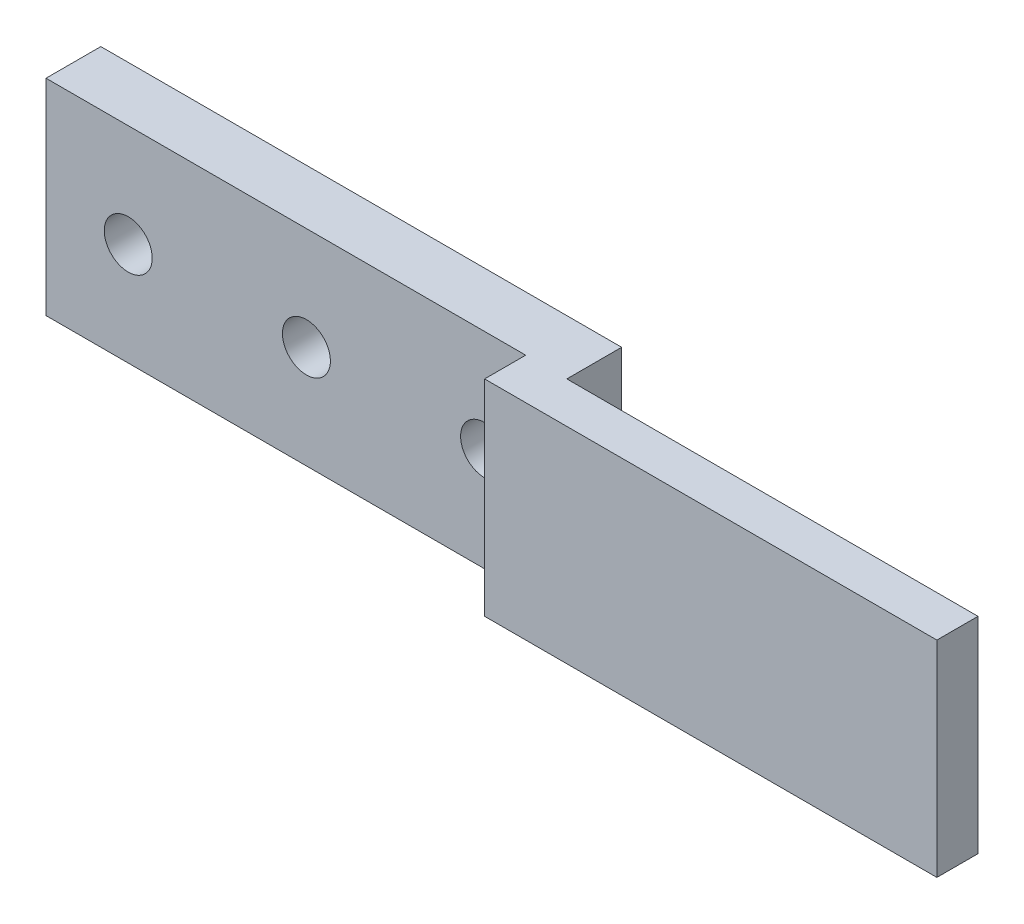
ISO-10303-21;
HEADER;
FILE_DESCRIPTION(('STEP AP214'),'2;1');
FILE_NAME('part.step','',(''),(''),'','','');
FILE_SCHEMA(('AUTOMOTIVE_DESIGN { 1 0 10303 214 1 1 1 1 }'));
ENDSEC;
DATA;
#1=APPLICATION_CONTEXT('core data for automotive mechanical design processes');
#2=APPLICATION_PROTOCOL_DEFINITION('international standard','automotive_design',2000,#1);
#3=PRODUCT_CONTEXT('',#1,'mechanical');
#4=PRODUCT('Part','Part','',(#3));
#5=PRODUCT_RELATED_PRODUCT_CATEGORY('part','',(#4));
#6=PRODUCT_DEFINITION_FORMATION('','',#4);
#7=PRODUCT_DEFINITION_CONTEXT('part definition',#1,'design');
#8=PRODUCT_DEFINITION('design','',#6,#7);
#9=PRODUCT_DEFINITION_SHAPE('','',#8);
#10=(LENGTH_UNIT() NAMED_UNIT(*) SI_UNIT(.MILLI.,.METRE.));
#11=(NAMED_UNIT(*) PLANE_ANGLE_UNIT() SI_UNIT($,.RADIAN.));
#12=(NAMED_UNIT(*) SI_UNIT($,.STERADIAN.) SOLID_ANGLE_UNIT());
#13=UNCERTAINTY_MEASURE_WITH_UNIT(LENGTH_MEASURE(1.E-05),#10,'distance_accuracy_value','');
#14=(GEOMETRIC_REPRESENTATION_CONTEXT(3) GLOBAL_UNCERTAINTY_ASSIGNED_CONTEXT((#13)) GLOBAL_UNIT_ASSIGNED_CONTEXT((#10,
#11,#12)) REPRESENTATION_CONTEXT('',''));
#15=CARTESIAN_POINT('',(0.,0.,0.));
#16=DIRECTION('',(0.,0.,1.));
#17=DIRECTION('',(1.,0.,0.));
#18=AXIS2_PLACEMENT_3D('',#15,#16,#17);
#19=CARTESIAN_POINT('',(12.5,-7.5,3.));
#20=DIRECTION('',(-1.,0.,0.));
#21=DIRECTION('',(0.,0.,1.));
#22=AXIS2_PLACEMENT_3D('',#19,#20,#21);
#23=PLANE('',#22);
#24=DIRECTION('',(0.,1.,0.));
#25=VECTOR('',#24,1.);
#26=CARTESIAN_POINT('',(12.5,-7.50000000000001,3.));
#27=LINE('',#26,#25);
#28=CARTESIAN_POINT('',(12.5,-7.5,3.));
#29=VERTEX_POINT('',#28);
#30=CARTESIAN_POINT('',(12.5,7.5,3.));
#31=VERTEX_POINT('',#30);
#32=EDGE_CURVE('E58',#29,#31,#27,.T.);
#33=ORIENTED_EDGE('',*,*,#32,.F.);
#34=DIRECTION('',(0.,0.,-1.));
#35=VECTOR('',#34,1.);
#36=CARTESIAN_POINT('',(12.5,-7.5,3.));
#37=LINE('',#36,#35);
#38=CARTESIAN_POINT('',(12.5,-7.5,-1.));
#39=VERTEX_POINT('',#38);
#40=EDGE_CURVE('E11',#29,#39,#37,.T.);
#41=ORIENTED_EDGE('',*,*,#40,.T.);
#42=DIRECTION('',(0.,-1.,0.));
#43=VECTOR('',#42,1.);
#44=CARTESIAN_POINT('',(12.5,7.5,-1.));
#45=LINE('',#44,#43);
#46=CARTESIAN_POINT('',(12.5,7.5,-1.));
#47=VERTEX_POINT('',#46);
#48=EDGE_CURVE('E116',#47,#39,#45,.T.);
#49=ORIENTED_EDGE('',*,*,#48,.F.);
#50=DIRECTION('',(0.,0.,-1.));
#51=VECTOR('',#50,1.);
#52=CARTESIAN_POINT('',(12.5,7.5,3.));
#53=LINE('',#52,#51);
#54=EDGE_CURVE('E52',#31,#47,#53,.T.);
#55=ORIENTED_EDGE('',*,*,#54,.F.);
#56=EDGE_LOOP('',(#33,#41,#49,#55));
#57=FACE_BOUND('',#56,.T.);
#58=ADVANCED_FACE('F43',(#57),#23,.F.);
#59=CARTESIAN_POINT('',(12.5,-7.5,3.));
#60=DIRECTION('',(0.,1.,0.));
#61=DIRECTION('',(-1.,0.,0.));
#62=AXIS2_PLACEMENT_3D('',#59,#60,#61);
#63=PLANE('',#62);
#64=DIRECTION('',(1.,0.,0.));
#65=VECTOR('',#64,1.);
#66=CARTESIAN_POINT('',(12.5,-7.5,3.));
#67=LINE('',#66,#65);
#68=CARTESIAN_POINT('',(-25.5,-7.5,3.));
#69=VERTEX_POINT('',#68);
#70=CARTESIAN_POINT('',(9.5,-7.5,3.));
#71=VERTEX_POINT('',#70);
#72=EDGE_CURVE('E124',#69,#71,#67,.T.);
#73=ORIENTED_EDGE('',*,*,#72,.F.);
#74=DIRECTION('',(0.,0.,1.));
#75=VECTOR('',#74,1.);
#76=CARTESIAN_POINT('',(-25.5,-7.5,-1.));
#77=LINE('',#76,#75);
#78=CARTESIAN_POINT('',(-25.5,-7.5,-1.));
#79=VERTEX_POINT('',#78);
#80=EDGE_CURVE('E122',#79,#69,#77,.T.);
#81=ORIENTED_EDGE('',*,*,#80,.F.);
#82=DIRECTION('',(-1.,0.,0.));
#83=VECTOR('',#82,1.);
#84=CARTESIAN_POINT('',(12.5,-7.5,-1.));
#85=LINE('',#84,#83);
#86=EDGE_CURVE('E109',#39,#79,#85,.T.);
#87=ORIENTED_EDGE('',*,*,#86,.F.);
#88=ORIENTED_EDGE('',*,*,#40,.F.);
#89=DIRECTION('',(-1.,0.,0.));
#90=VECTOR('',#89,1.);
#91=CARTESIAN_POINT('',(42.5,-7.50000000000001,3.));
#92=LINE('',#91,#90);
#93=CARTESIAN_POINT('',(42.5,-7.50000000000001,3.));
#94=VERTEX_POINT('',#93);
#95=EDGE_CURVE('E188',#94,#29,#92,.T.);
#96=ORIENTED_EDGE('',*,*,#95,.F.);
#97=DIRECTION('',(0.,0.,-1.));
#98=VECTOR('',#97,1.);
#99=CARTESIAN_POINT('',(42.5,-7.50000000000001,6.));
#100=LINE('',#99,#98);
#101=CARTESIAN_POINT('',(42.5,-7.50000000000001,6.));
#102=VERTEX_POINT('',#101);
#103=EDGE_CURVE('E172',#102,#94,#100,.T.);
#104=ORIENTED_EDGE('',*,*,#103,.F.);
#105=DIRECTION('',(1.,0.,0.));
#106=VECTOR('',#105,1.);
#107=CARTESIAN_POINT('',(12.5,-7.50000000000001,6.));
#108=LINE('',#107,#106);
#109=CARTESIAN_POINT('',(9.5,-7.5,6.));
#110=VERTEX_POINT('',#109);
#111=EDGE_CURVE('E198',#110,#102,#108,.T.);
#112=ORIENTED_EDGE('',*,*,#111,.F.);
#113=DIRECTION('',(0.,0.,-1.));
#114=VECTOR('',#113,1.);
#115=CARTESIAN_POINT('',(9.5,-7.5,6.));
#116=LINE('',#115,#114);
#117=EDGE_CURVE('E201',#110,#71,#116,.T.);
#118=ORIENTED_EDGE('',*,*,#117,.T.);
#119=EDGE_LOOP('',(#73,#81,#87,#88,#96,#104,#112,#118));
#120=FACE_BOUND('',#119,.T.);
#121=ADVANCED_FACE('F45',(#120),#63,.F.);
#122=CARTESIAN_POINT('',(12.5,7.5,3.));
#123=DIRECTION('',(0.,-1.,0.));
#124=DIRECTION('',(1.,0.,0.));
#125=AXIS2_PLACEMENT_3D('',#122,#123,#124);
#126=PLANE('',#125);
#127=ORIENTED_EDGE('',*,*,#54,.T.);
#128=DIRECTION('',(1.,0.,0.));
#129=VECTOR('',#128,1.);
#130=CARTESIAN_POINT('',(12.5,7.5,-1.));
#131=LINE('',#130,#129);
#132=CARTESIAN_POINT('',(-25.5,7.5,-1.));
#133=VERTEX_POINT('',#132);
#134=EDGE_CURVE('E119',#133,#47,#131,.T.);
#135=ORIENTED_EDGE('',*,*,#134,.F.);
#136=DIRECTION('',(0.,0.,-1.));
#137=VECTOR('',#136,1.);
#138=CARTESIAN_POINT('',(-25.5,7.5,-1.));
#139=LINE('',#138,#137);
#140=CARTESIAN_POINT('',(-25.5,7.5,3.));
#141=VERTEX_POINT('',#140);
#142=EDGE_CURVE('E134',#141,#133,#139,.T.);
#143=ORIENTED_EDGE('',*,*,#142,.F.);
#144=DIRECTION('',(-1.,0.,0.));
#145=VECTOR('',#144,1.);
#146=CARTESIAN_POINT('',(12.5,7.5,3.));
#147=LINE('',#146,#145);
#148=CARTESIAN_POINT('',(9.5,7.5,3.));
#149=VERTEX_POINT('',#148);
#150=EDGE_CURVE('E212',#149,#141,#147,.T.);
#151=ORIENTED_EDGE('',*,*,#150,.F.);
#152=DIRECTION('',(0.,0.,-1.));
#153=VECTOR('',#152,1.);
#154=CARTESIAN_POINT('',(9.5,7.5,6.));
#155=LINE('',#154,#153);
#156=CARTESIAN_POINT('',(9.5,7.5,6.));
#157=VERTEX_POINT('',#156);
#158=EDGE_CURVE('E206',#157,#149,#155,.T.);
#159=ORIENTED_EDGE('',*,*,#158,.F.);
#160=DIRECTION('',(-1.,0.,0.));
#161=VECTOR('',#160,1.);
#162=CARTESIAN_POINT('',(12.5,7.5,6.));
#163=LINE('',#162,#161);
#164=CARTESIAN_POINT('',(42.5,7.5,6.));
#165=VERTEX_POINT('',#164);
#166=EDGE_CURVE('E192',#165,#157,#163,.T.);
#167=ORIENTED_EDGE('',*,*,#166,.F.);
#168=DIRECTION('',(0.,0.,1.));
#169=VECTOR('',#168,1.);
#170=CARTESIAN_POINT('',(42.5,7.5,6.));
#171=LINE('',#170,#169);
#172=CARTESIAN_POINT('',(42.5,7.5,3.));
#173=VERTEX_POINT('',#172);
#174=EDGE_CURVE('E178',#173,#165,#171,.T.);
#175=ORIENTED_EDGE('',*,*,#174,.F.);
#176=DIRECTION('',(-1.,0.,0.));
#177=VECTOR('',#176,1.);
#178=CARTESIAN_POINT('',(42.5,7.5,3.));
#179=LINE('',#178,#177);
#180=EDGE_CURVE('E182',#173,#31,#179,.T.);
#181=ORIENTED_EDGE('',*,*,#180,.T.);
#182=EDGE_LOOP('',(#127,#135,#143,#151,#159,#167,#175,#181));
#183=FACE_BOUND('',#182,.T.);
#184=ADVANCED_FACE('F216',(#183),#126,.F.);
#185=CARTESIAN_POINT('',(0.,0.,3.));
#186=DIRECTION('',(0.,0.,1.));
#187=DIRECTION('',(1.,0.,0.));
#188=AXIS2_PLACEMENT_3D('',#185,#186,#187);
#189=PLANE('',#188);
#190=CARTESIAN_POINT('',(-19.5,0.,3.));
#191=DIRECTION('',(0.,0.,1.));
#192=DIRECTION('',(1.,0.,0.));
#193=AXIS2_PLACEMENT_3D('',#190,#191,#192);
#194=CIRCLE('',#193,1.75);
#195=CARTESIAN_POINT('',(-17.75,0.,3.));
#196=VERTEX_POINT('',#195);
#197=EDGE_CURVE('E140',#196,#196,#194,.T.);
#198=ORIENTED_EDGE('',*,*,#197,.F.);
#199=EDGE_LOOP('',(#198));
#200=FACE_BOUND('',#199,.T.);
#201=CARTESIAN_POINT('',(6.5,0.,3.));
#202=DIRECTION('',(0.,0.,1.));
#203=DIRECTION('',(1.,0.,0.));
#204=AXIS2_PLACEMENT_3D('',#201,#202,#203);
#205=CIRCLE('',#204,1.75);
#206=CARTESIAN_POINT('',(8.25,0.,3.));
#207=VERTEX_POINT('',#206);
#208=EDGE_CURVE('E160',#207,#207,#205,.T.);
#209=ORIENTED_EDGE('',*,*,#208,.F.);
#210=EDGE_LOOP('',(#209));
#211=FACE_BOUND('',#210,.T.);
#212=CARTESIAN_POINT('',(-6.5,0.,3.));
#213=DIRECTION('',(0.,0.,1.));
#214=DIRECTION('',(1.,0.,0.));
#215=AXIS2_PLACEMENT_3D('',#212,#213,#214);
#216=CIRCLE('',#215,1.75);
#217=CARTESIAN_POINT('',(-4.75,0.,3.));
#218=VERTEX_POINT('',#217);
#219=EDGE_CURVE('E153',#218,#218,#216,.T.);
#220=ORIENTED_EDGE('',*,*,#219,.F.);
#221=EDGE_LOOP('',(#220));
#222=FACE_BOUND('',#221,.T.);
#223=DIRECTION('',(0.,-1.,0.));
#224=VECTOR('',#223,1.);
#225=CARTESIAN_POINT('',(9.5,7.5,3.));
#226=LINE('',#225,#224);
#227=EDGE_CURVE('E66',#149,#71,#226,.T.);
#228=ORIENTED_EDGE('',*,*,#227,.F.);
#229=ORIENTED_EDGE('',*,*,#150,.T.);
#230=DIRECTION('',(0.,1.,0.));
#231=VECTOR('',#230,1.);
#232=CARTESIAN_POINT('',(-25.5,7.5,3.));
#233=LINE('',#232,#231);
#234=EDGE_CURVE('E129',#69,#141,#233,.T.);
#235=ORIENTED_EDGE('',*,*,#234,.F.);
#236=ORIENTED_EDGE('',*,*,#72,.T.);
#237=EDGE_LOOP('',(#228,#229,#235,#236));
#238=FACE_BOUND('',#237,.T.);
#239=ADVANCED_FACE('F235',(#200,#211,#222,#238),#189,.T.);
#240=CARTESIAN_POINT('',(9.5,7.5,6.));
#241=DIRECTION('',(1.,0.,0.));
#242=DIRECTION('',(0.,1.,0.));
#243=AXIS2_PLACEMENT_3D('',#240,#241,#242);
#244=PLANE('',#243);
#245=ORIENTED_EDGE('',*,*,#227,.T.);
#246=ORIENTED_EDGE('',*,*,#117,.F.);
#247=DIRECTION('',(0.,-1.,0.));
#248=VECTOR('',#247,1.);
#249=CARTESIAN_POINT('',(9.5,7.5,6.));
#250=LINE('',#249,#248);
#251=EDGE_CURVE('E195',#157,#110,#250,.T.);
#252=ORIENTED_EDGE('',*,*,#251,.F.);
#253=ORIENTED_EDGE('',*,*,#158,.T.);
#254=EDGE_LOOP('',(#245,#246,#252,#253));
#255=FACE_BOUND('',#254,.T.);
#256=ADVANCED_FACE('F234',(#255),#244,.F.);
#257=CARTESIAN_POINT('',(0.,0.,6.));
#258=DIRECTION('',(0.,0.,-1.));
#259=DIRECTION('',(-1.,0.,0.));
#260=AXIS2_PLACEMENT_3D('',#257,#258,#259);
#261=PLANE('',#260);
#262=ORIENTED_EDGE('',*,*,#111,.T.);
#263=DIRECTION('',(0.,-1.,0.));
#264=VECTOR('',#263,1.);
#265=CARTESIAN_POINT('',(42.5,-7.50000000000001,6.));
#266=LINE('',#265,#264);
#267=EDGE_CURVE('E168',#165,#102,#266,.T.);
#268=ORIENTED_EDGE('',*,*,#267,.F.);
#269=ORIENTED_EDGE('',*,*,#166,.T.);
#270=ORIENTED_EDGE('',*,*,#251,.T.);
#271=EDGE_LOOP('',(#262,#268,#269,#270));
#272=FACE_BOUND('',#271,.T.);
#273=ADVANCED_FACE('F230',(#272),#261,.F.);
#274=CARTESIAN_POINT('',(42.5,-7.50000000000001,3.));
#275=DIRECTION('',(0.,0.,1.));
#276=DIRECTION('',(1.,0.,0.));
#277=AXIS2_PLACEMENT_3D('',#274,#275,#276);
#278=PLANE('',#277);
#279=ORIENTED_EDGE('',*,*,#32,.T.);
#280=ORIENTED_EDGE('',*,*,#180,.F.);
#281=DIRECTION('',(0.,1.,0.));
#282=VECTOR('',#281,1.);
#283=CARTESIAN_POINT('',(42.5,-7.50000000000001,3.));
#284=LINE('',#283,#282);
#285=EDGE_CURVE('E175',#94,#173,#284,.T.);
#286=ORIENTED_EDGE('',*,*,#285,.F.);
#287=ORIENTED_EDGE('',*,*,#95,.T.);
#288=EDGE_LOOP('',(#279,#280,#286,#287));
#289=FACE_BOUND('',#288,.T.);
#290=ADVANCED_FACE('F223',(#289),#278,.F.);
#291=CARTESIAN_POINT('',(42.5,0.,0.));
#292=DIRECTION('',(-1.,0.,0.));
#293=DIRECTION('',(0.,0.,1.));
#294=AXIS2_PLACEMENT_3D('',#291,#292,#293);
#295=PLANE('',#294);
#296=ORIENTED_EDGE('',*,*,#267,.T.);
#297=ORIENTED_EDGE('',*,*,#103,.T.);
#298=ORIENTED_EDGE('',*,*,#285,.T.);
#299=ORIENTED_EDGE('',*,*,#174,.T.);
#300=EDGE_LOOP('',(#296,#297,#298,#299));
#301=FACE_BOUND('',#300,.T.);
#302=ADVANCED_FACE('F225',(#301),#295,.F.);
#303=CARTESIAN_POINT('',(0.,0.,-1.));
#304=DIRECTION('',(0.,0.,-1.));
#305=DIRECTION('',(-1.,0.,0.));
#306=AXIS2_PLACEMENT_3D('',#303,#304,#305);
#307=PLANE('',#306);
#308=CARTESIAN_POINT('',(-19.5,0.,-1.));
#309=DIRECTION('',(0.,0.,1.));
#310=DIRECTION('',(1.,0.,0.));
#311=AXIS2_PLACEMENT_3D('',#308,#309,#310);
#312=CIRCLE('',#311,1.75);
#313=CARTESIAN_POINT('',(-17.75,0.,-1.));
#314=VERTEX_POINT('',#313);
#315=EDGE_CURVE('E136',#314,#314,#312,.T.);
#316=ORIENTED_EDGE('',*,*,#315,.T.);
#317=EDGE_LOOP('',(#316));
#318=FACE_BOUND('',#317,.T.);
#319=CARTESIAN_POINT('',(6.5,0.,-1.));
#320=DIRECTION('',(0.,0.,-1.));
#321=DIRECTION('',(-1.,0.,0.));
#322=AXIS2_PLACEMENT_3D('',#319,#320,#321);
#323=CIRCLE('',#322,1.75);
#324=CARTESIAN_POINT('',(4.75,0.,-1.));
#325=VERTEX_POINT('',#324);
#326=EDGE_CURVE('E149',#325,#325,#323,.T.);
#327=ORIENTED_EDGE('',*,*,#326,.F.);
#328=EDGE_LOOP('',(#327));
#329=FACE_BOUND('',#328,.T.);
#330=CARTESIAN_POINT('',(-6.5,0.,-1.));
#331=DIRECTION('',(0.,0.,-1.));
#332=DIRECTION('',(1.,0.,0.));
#333=AXIS2_PLACEMENT_3D('',#330,#331,#332);
#334=CIRCLE('',#333,1.75);
#335=CARTESIAN_POINT('',(-4.75,0.,-1.));
#336=VERTEX_POINT('',#335);
#337=EDGE_CURVE('E148',#336,#336,#334,.T.);
#338=ORIENTED_EDGE('',*,*,#337,.F.);
#339=EDGE_LOOP('',(#338));
#340=FACE_BOUND('',#339,.T.);
#341=ORIENTED_EDGE('',*,*,#48,.T.);
#342=ORIENTED_EDGE('',*,*,#86,.T.);
#343=DIRECTION('',(0.,-1.,0.));
#344=VECTOR('',#343,1.);
#345=CARTESIAN_POINT('',(-25.5,7.5,-1.));
#346=LINE('',#345,#344);
#347=EDGE_CURVE('E114',#133,#79,#346,.T.);
#348=ORIENTED_EDGE('',*,*,#347,.F.);
#349=ORIENTED_EDGE('',*,*,#134,.T.);
#350=EDGE_LOOP('',(#341,#342,#348,#349));
#351=FACE_BOUND('',#350,.T.);
#352=ADVANCED_FACE('F111',(#318,#329,#340,#351),#307,.T.);
#353=CARTESIAN_POINT('',(-6.5,0.,6.));
#354=DIRECTION('',(0.,0.,-1.));
#355=DIRECTION('',(-1.,0.,0.));
#356=AXIS2_PLACEMENT_3D('',#353,#354,#355);
#357=CYLINDRICAL_SURFACE('',#356,1.75);
#358=ORIENTED_EDGE('',*,*,#219,.T.);
#359=EDGE_LOOP('',(#358));
#360=FACE_BOUND('',#359,.T.);
#361=ORIENTED_EDGE('',*,*,#337,.T.);
#362=EDGE_LOOP('',(#361));
#363=FACE_BOUND('',#362,.T.);
#364=ADVANCED_FACE('F287',(#360,#363),#357,.F.);
#365=CARTESIAN_POINT('',(6.5,0.,6.));
#366=DIRECTION('',(0.,0.,-1.));
#367=DIRECTION('',(-1.,0.,0.));
#368=AXIS2_PLACEMENT_3D('',#365,#366,#367);
#369=CYLINDRICAL_SURFACE('',#368,1.75);
#370=ORIENTED_EDGE('',*,*,#208,.T.);
#371=EDGE_LOOP('',(#370));
#372=FACE_BOUND('',#371,.T.);
#373=ORIENTED_EDGE('',*,*,#326,.T.);
#374=EDGE_LOOP('',(#373));
#375=FACE_BOUND('',#374,.T.);
#376=ADVANCED_FACE('F269',(#372,#375),#369,.F.);
#377=CARTESIAN_POINT('',(-25.5,0.,0.));
#378=DIRECTION('',(-1.,0.,0.));
#379=DIRECTION('',(0.,0.,1.));
#380=AXIS2_PLACEMENT_3D('',#377,#378,#379);
#381=PLANE('',#380);
#382=ORIENTED_EDGE('',*,*,#347,.T.);
#383=ORIENTED_EDGE('',*,*,#80,.T.);
#384=ORIENTED_EDGE('',*,*,#234,.T.);
#385=ORIENTED_EDGE('',*,*,#142,.T.);
#386=EDGE_LOOP('',(#382,#383,#384,#385));
#387=FACE_BOUND('',#386,.T.);
#388=ADVANCED_FACE('F132',(#387),#381,.T.);
#389=CARTESIAN_POINT('',(-19.5,0.,-1.));
#390=DIRECTION('',(0.,0.,1.));
#391=DIRECTION('',(1.,0.,0.));
#392=AXIS2_PLACEMENT_3D('',#389,#390,#391);
#393=CYLINDRICAL_SURFACE('',#392,1.75);
#394=ORIENTED_EDGE('',*,*,#315,.F.);
#395=EDGE_LOOP('',(#394));
#396=FACE_BOUND('',#395,.T.);
#397=ORIENTED_EDGE('',*,*,#197,.T.);
#398=EDGE_LOOP('',(#397));
#399=FACE_BOUND('',#398,.T.);
#400=ADVANCED_FACE('F268',(#396,#399),#393,.F.);
#401=CLOSED_SHELL('',(#58,#121,#184,#239,#256,#273,#290,#302,#352,#364,#376,#388,#400));
#402=MANIFOLD_SOLID_BREP('B2',#401);
#403=ADVANCED_BREP_SHAPE_REPRESENTATION('',(#18,#402),#14);
#404=SHAPE_DEFINITION_REPRESENTATION(#9,#403);
ENDSEC;
END-ISO-10303-21;
